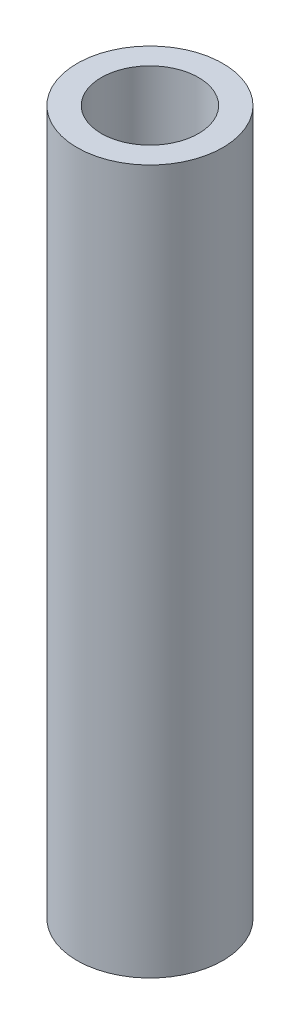
ISO-10303-21;
HEADER;
FILE_DESCRIPTION(('STEP AP214'),'2;1');
FILE_NAME('part.step','',(''),(''),'','','');
FILE_SCHEMA(('AUTOMOTIVE_DESIGN { 1 0 10303 214 1 1 1 1 }'));
ENDSEC;
DATA;
#1=APPLICATION_CONTEXT('core data for automotive mechanical design processes');
#2=APPLICATION_PROTOCOL_DEFINITION('international standard','automotive_design',2000,#1);
#3=PRODUCT_CONTEXT('',#1,'mechanical');
#4=PRODUCT('Part','Part','',(#3));
#5=PRODUCT_RELATED_PRODUCT_CATEGORY('part','',(#4));
#6=PRODUCT_DEFINITION_FORMATION('','',#4);
#7=PRODUCT_DEFINITION_CONTEXT('part definition',#1,'design');
#8=PRODUCT_DEFINITION('design','',#6,#7);
#9=PRODUCT_DEFINITION_SHAPE('','',#8);
#10=(LENGTH_UNIT() NAMED_UNIT(*) SI_UNIT(.MILLI.,.METRE.));
#11=(NAMED_UNIT(*) PLANE_ANGLE_UNIT() SI_UNIT($,.RADIAN.));
#12=(NAMED_UNIT(*) SI_UNIT($,.STERADIAN.) SOLID_ANGLE_UNIT());
#13=UNCERTAINTY_MEASURE_WITH_UNIT(LENGTH_MEASURE(1.E-05),#10,'distance_accuracy_value','');
#14=(GEOMETRIC_REPRESENTATION_CONTEXT(3) GLOBAL_UNCERTAINTY_ASSIGNED_CONTEXT((#13)) GLOBAL_UNIT_ASSIGNED_CONTEXT((#10,
#11,#12)) REPRESENTATION_CONTEXT('',''));
#15=CARTESIAN_POINT('',(0.,0.,0.));
#16=DIRECTION('',(0.,0.,1.));
#17=DIRECTION('',(1.,0.,0.));
#18=AXIS2_PLACEMENT_3D('',#15,#16,#17);
#19=CARTESIAN_POINT('',(0.,46.,0.));
#20=DIRECTION('',(0.,1.,0.));
#21=DIRECTION('',(0.,0.,1.));
#22=AXIS2_PLACEMENT_3D('',#19,#20,#21);
#23=PLANE('',#22);
#24=CARTESIAN_POINT('',(0.,46.,0.));
#25=DIRECTION('',(0.,1.,0.));
#26=DIRECTION('',(0.,0.,1.));
#27=AXIS2_PLACEMENT_3D('',#24,#25,#26);
#28=CIRCLE('',#27,4.7625);
#29=CARTESIAN_POINT('',(0.,46.,4.7625));
#30=VERTEX_POINT('',#29);
#31=EDGE_CURVE('E10',#30,#30,#28,.T.);
#32=ORIENTED_EDGE('',*,*,#31,.T.);
#33=EDGE_LOOP('',(#32));
#34=FACE_BOUND('',#33,.T.);
#35=CARTESIAN_POINT('',(0.,46.,0.));
#36=DIRECTION('',(0.,1.,0.));
#37=DIRECTION('',(0.,0.,1.));
#38=AXIS2_PLACEMENT_3D('',#35,#36,#37);
#39=CIRCLE('',#38,3.175);
#40=CARTESIAN_POINT('',(0.,46.,3.175));
#41=VERTEX_POINT('',#40);
#42=EDGE_CURVE('E54',#41,#41,#39,.T.);
#43=ORIENTED_EDGE('',*,*,#42,.F.);
#44=EDGE_LOOP('',(#43));
#45=FACE_BOUND('',#44,.T.);
#46=ADVANCED_FACE('F41',(#34,#45),#23,.T.);
#47=CARTESIAN_POINT('',(0.,0.,0.));
#48=DIRECTION('',(0.,1.,0.));
#49=DIRECTION('',(0.,0.,1.));
#50=AXIS2_PLACEMENT_3D('',#47,#48,#49);
#51=PLANE('',#50);
#52=CARTESIAN_POINT('',(0.,0.,0.));
#53=DIRECTION('',(0.,1.,0.));
#54=DIRECTION('',(0.,0.,1.));
#55=AXIS2_PLACEMENT_3D('',#52,#53,#54);
#56=CIRCLE('',#55,4.7625);
#57=CARTESIAN_POINT('',(0.,0.,4.7625));
#58=VERTEX_POINT('',#57);
#59=EDGE_CURVE('E45',#58,#58,#56,.T.);
#60=ORIENTED_EDGE('',*,*,#59,.F.);
#61=EDGE_LOOP('',(#60));
#62=FACE_BOUND('',#61,.T.);
#63=CARTESIAN_POINT('',(0.,0.,0.));
#64=DIRECTION('',(0.,1.,0.));
#65=DIRECTION('',(0.,0.,1.));
#66=AXIS2_PLACEMENT_3D('',#63,#64,#65);
#67=CIRCLE('',#66,3.175);
#68=CARTESIAN_POINT('',(0.,0.,3.175));
#69=VERTEX_POINT('',#68);
#70=EDGE_CURVE('E56',#69,#69,#67,.T.);
#71=ORIENTED_EDGE('',*,*,#70,.T.);
#72=EDGE_LOOP('',(#71));
#73=FACE_BOUND('',#72,.T.);
#74=ADVANCED_FACE('F68',(#62,#73),#51,.F.);
#75=CARTESIAN_POINT('',(0.,46.,0.));
#76=DIRECTION('',(0.,-1.,0.));
#77=DIRECTION('',(0.,0.,-1.));
#78=AXIS2_PLACEMENT_3D('',#75,#76,#77);
#79=CYLINDRICAL_SURFACE('',#78,4.7625);
#80=ORIENTED_EDGE('',*,*,#31,.F.);
#81=EDGE_LOOP('',(#80));
#82=FACE_BOUND('',#81,.T.);
#83=ORIENTED_EDGE('',*,*,#59,.T.);
#84=EDGE_LOOP('',(#83));
#85=FACE_BOUND('',#84,.T.);
#86=ADVANCED_FACE('F43',(#82,#85),#79,.T.);
#87=CARTESIAN_POINT('',(0.,46.,0.));
#88=DIRECTION('',(0.,-1.,0.));
#89=DIRECTION('',(0.,0.,-1.));
#90=AXIS2_PLACEMENT_3D('',#87,#88,#89);
#91=CYLINDRICAL_SURFACE('',#90,3.175);
#92=ORIENTED_EDGE('',*,*,#42,.T.);
#93=EDGE_LOOP('',(#92));
#94=FACE_BOUND('',#93,.T.);
#95=ORIENTED_EDGE('',*,*,#70,.F.);
#96=EDGE_LOOP('',(#95));
#97=FACE_BOUND('',#96,.T.);
#98=ADVANCED_FACE('F64',(#94,#97),#91,.F.);
#99=CLOSED_SHELL('',(#46,#74,#86,#98));
#100=MANIFOLD_SOLID_BREP('B2',#99);
#101=ADVANCED_BREP_SHAPE_REPRESENTATION('',(#18,#100),#14);
#102=SHAPE_DEFINITION_REPRESENTATION(#9,#101);
ENDSEC;
END-ISO-10303-21;
